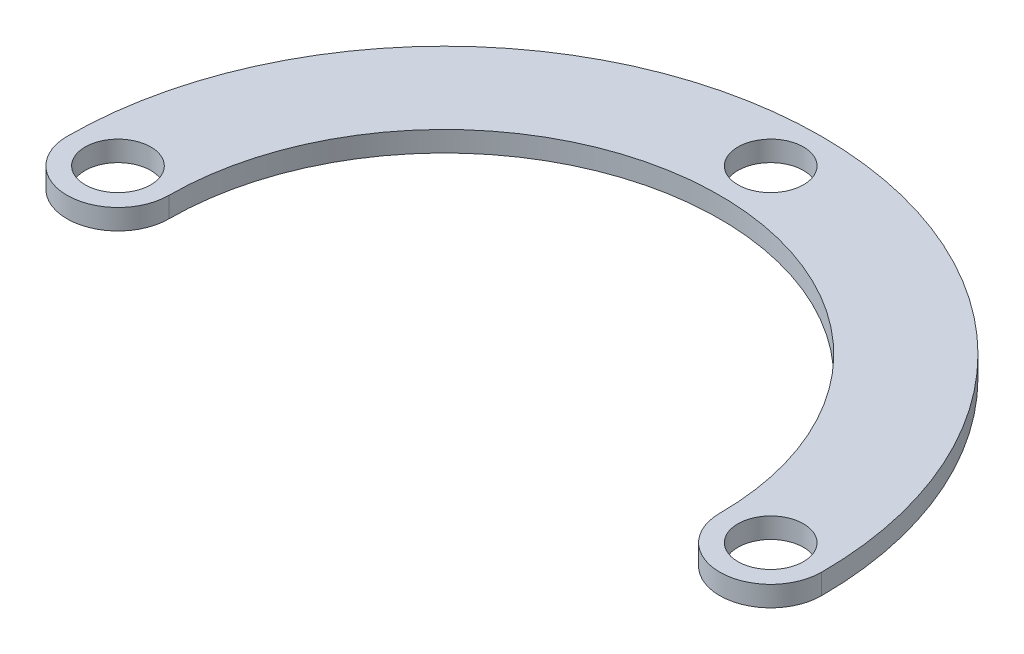
ISO-10303-21;
HEADER;
FILE_DESCRIPTION(('STEP AP214'),'2;1');
FILE_NAME('part.step','',(''),(''),'','','');
FILE_SCHEMA(('AUTOMOTIVE_DESIGN { 1 0 10303 214 1 1 1 1 }'));
ENDSEC;
DATA;
#1=APPLICATION_CONTEXT('core data for automotive mechanical design processes');
#2=APPLICATION_PROTOCOL_DEFINITION('international standard','automotive_design',2000,#1);
#3=PRODUCT_CONTEXT('',#1,'mechanical');
#4=PRODUCT('Part','Part','',(#3));
#5=PRODUCT_RELATED_PRODUCT_CATEGORY('part','',(#4));
#6=PRODUCT_DEFINITION_FORMATION('','',#4);
#7=PRODUCT_DEFINITION_CONTEXT('part definition',#1,'design');
#8=PRODUCT_DEFINITION('design','',#6,#7);
#9=PRODUCT_DEFINITION_SHAPE('','',#8);
#10=(LENGTH_UNIT() NAMED_UNIT(*) SI_UNIT(.MILLI.,.METRE.));
#11=(NAMED_UNIT(*) PLANE_ANGLE_UNIT() SI_UNIT($,.RADIAN.));
#12=(NAMED_UNIT(*) SI_UNIT($,.STERADIAN.) SOLID_ANGLE_UNIT());
#13=UNCERTAINTY_MEASURE_WITH_UNIT(LENGTH_MEASURE(1.E-05),#10,'distance_accuracy_value','');
#14=(GEOMETRIC_REPRESENTATION_CONTEXT(3) GLOBAL_UNCERTAINTY_ASSIGNED_CONTEXT((#13)) GLOBAL_UNIT_ASSIGNED_CONTEXT((#10,
#11,#12)) REPRESENTATION_CONTEXT('',''));
#15=CARTESIAN_POINT('',(0.,0.,0.));
#16=DIRECTION('',(0.,0.,1.));
#17=DIRECTION('',(1.,0.,0.));
#18=AXIS2_PLACEMENT_3D('',#15,#16,#17);
#19=CARTESIAN_POINT('',(25.4,1.5875,0.));
#20=DIRECTION('',(0.,-1.,0.));
#21=DIRECTION('',(0.,0.,-1.));
#22=AXIS2_PLACEMENT_3D('',#19,#20,#21);
#23=CYLINDRICAL_SURFACE('',#22,2.5527);
#24=CARTESIAN_POINT('',(25.4,1.5875,0.));
#25=DIRECTION('',(0.,1.,0.));
#26=DIRECTION('',(0.,0.,1.));
#27=AXIS2_PLACEMENT_3D('',#24,#25,#26);
#28=CIRCLE('',#27,2.5527);
#29=CARTESIAN_POINT('',(25.4,1.5875,2.55269999999998));
#30=VERTEX_POINT('',#29);
#31=EDGE_CURVE('E20',#30,#30,#28,.T.);
#32=ORIENTED_EDGE('',*,*,#31,.T.);
#33=EDGE_LOOP('',(#32));
#34=FACE_BOUND('',#33,.T.);
#35=CARTESIAN_POINT('',(25.4,0.,0.));
#36=DIRECTION('',(0.,1.,0.));
#37=DIRECTION('',(0.,0.,1.));
#38=AXIS2_PLACEMENT_3D('',#35,#36,#37);
#39=CIRCLE('',#38,2.5527);
#40=CARTESIAN_POINT('',(25.4,0.,2.55269999999998));
#41=VERTEX_POINT('',#40);
#42=EDGE_CURVE('E150',#41,#41,#39,.T.);
#43=ORIENTED_EDGE('',*,*,#42,.F.);
#44=EDGE_LOOP('',(#43));
#45=FACE_BOUND('',#44,.T.);
#46=ADVANCED_FACE('F17',(#34,#45),#23,.F.);
#47=CARTESIAN_POINT('',(-25.4,1.5875,0.));
#48=DIRECTION('',(0.,-1.,0.));
#49=DIRECTION('',(0.,0.,-1.));
#50=AXIS2_PLACEMENT_3D('',#47,#48,#49);
#51=CYLINDRICAL_SURFACE('',#50,2.5527);
#52=CARTESIAN_POINT('',(-25.4,1.5875,0.));
#53=DIRECTION('',(0.,1.,0.));
#54=DIRECTION('',(0.,0.,1.));
#55=AXIS2_PLACEMENT_3D('',#52,#53,#54);
#56=CIRCLE('',#55,2.5527);
#57=CARTESIAN_POINT('',(-25.4,1.5875,2.5527));
#58=VERTEX_POINT('',#57);
#59=EDGE_CURVE('E11',#58,#58,#56,.T.);
#60=ORIENTED_EDGE('',*,*,#59,.T.);
#61=EDGE_LOOP('',(#60));
#62=FACE_BOUND('',#61,.T.);
#63=CARTESIAN_POINT('',(-25.4,0.,0.));
#64=DIRECTION('',(0.,1.,0.));
#65=DIRECTION('',(0.,0.,1.));
#66=AXIS2_PLACEMENT_3D('',#63,#64,#65);
#67=CIRCLE('',#66,2.5527);
#68=CARTESIAN_POINT('',(-25.4,0.,2.5527));
#69=VERTEX_POINT('',#68);
#70=EDGE_CURVE('E156',#69,#69,#67,.T.);
#71=ORIENTED_EDGE('',*,*,#70,.F.);
#72=EDGE_LOOP('',(#71));
#73=FACE_BOUND('',#72,.T.);
#74=ADVANCED_FACE('F169',(#62,#73),#51,.F.);
#75=CARTESIAN_POINT('',(0.,1.5875,-25.4));
#76=DIRECTION('',(0.,-1.,0.));
#77=DIRECTION('',(0.,0.,-1.));
#78=AXIS2_PLACEMENT_3D('',#75,#76,#77);
#79=CYLINDRICAL_SURFACE('',#78,2.5527);
#80=CARTESIAN_POINT('',(0.,1.5875,-25.4));
#81=DIRECTION('',(0.,1.,0.));
#82=DIRECTION('',(0.,0.,1.));
#83=AXIS2_PLACEMENT_3D('',#80,#81,#82);
#84=CIRCLE('',#83,2.5527);
#85=CARTESIAN_POINT('',(0.,1.5875,-22.8473));
#86=VERTEX_POINT('',#85);
#87=EDGE_CURVE('E127',#86,#86,#84,.T.);
#88=ORIENTED_EDGE('',*,*,#87,.T.);
#89=EDGE_LOOP('',(#88));
#90=FACE_BOUND('',#89,.T.);
#91=CARTESIAN_POINT('',(0.,0.,-25.4));
#92=DIRECTION('',(0.,1.,0.));
#93=DIRECTION('',(0.,0.,1.));
#94=AXIS2_PLACEMENT_3D('',#91,#92,#93);
#95=CIRCLE('',#94,2.5527);
#96=CARTESIAN_POINT('',(0.,0.,-22.8473));
#97=VERTEX_POINT('',#96);
#98=EDGE_CURVE('E145',#97,#97,#95,.T.);
#99=ORIENTED_EDGE('',*,*,#98,.F.);
#100=EDGE_LOOP('',(#99));
#101=FACE_BOUND('',#100,.T.);
#102=ADVANCED_FACE('F174',(#90,#101),#79,.F.);
#103=CARTESIAN_POINT('',(0.,1.5875,0.));
#104=DIRECTION('',(0.,-1.,0.));
#105=DIRECTION('',(0.,0.,-1.));
#106=AXIS2_PLACEMENT_3D('',#103,#104,#105);
#107=CYLINDRICAL_SURFACE('',#106,29.36875);
#108=CARTESIAN_POINT('',(0.,1.5875,0.));
#109=DIRECTION('',(0.,1.,0.));
#110=DIRECTION('',(0.,0.,1.));
#111=AXIS2_PLACEMENT_3D('',#108,#109,#110);
#112=CIRCLE('',#111,29.36875);
#113=CARTESIAN_POINT('',(29.36875,1.5875,0.));
#114=VERTEX_POINT('',#113);
#115=CARTESIAN_POINT('',(-29.36875,1.5875,0.));
#116=VERTEX_POINT('',#115);
#117=EDGE_CURVE('E27',#114,#116,#112,.T.);
#118=ORIENTED_EDGE('',*,*,#117,.F.);
#119=DIRECTION('',(0.,-1.,0.));
#120=VECTOR('',#119,1.);
#121=CARTESIAN_POINT('',(29.36875,1.5875,0.));
#122=LINE('',#121,#120);
#123=CARTESIAN_POINT('',(29.36875,0.,0.));
#124=VERTEX_POINT('',#123);
#125=EDGE_CURVE('E115',#114,#124,#122,.T.);
#126=ORIENTED_EDGE('',*,*,#125,.T.);
#127=CARTESIAN_POINT('',(0.,0.,0.));
#128=DIRECTION('',(0.,1.,0.));
#129=DIRECTION('',(0.,0.,1.));
#130=AXIS2_PLACEMENT_3D('',#127,#128,#129);
#131=CIRCLE('',#130,29.36875);
#132=CARTESIAN_POINT('',(-29.36875,0.,0.));
#133=VERTEX_POINT('',#132);
#134=EDGE_CURVE('E69',#124,#133,#131,.T.);
#135=ORIENTED_EDGE('',*,*,#134,.T.);
#136=DIRECTION('',(0.,-1.,0.));
#137=VECTOR('',#136,1.);
#138=CARTESIAN_POINT('',(-29.36875,1.5875,0.));
#139=LINE('',#138,#137);
#140=EDGE_CURVE('E99',#116,#133,#139,.T.);
#141=ORIENTED_EDGE('',*,*,#140,.F.);
#142=EDGE_LOOP('',(#118,#126,#135,#141));
#143=FACE_BOUND('',#142,.T.);
#144=ADVANCED_FACE('F234',(#143),#107,.T.);
#145=CARTESIAN_POINT('',(0.,1.5875,0.));
#146=DIRECTION('',(0.,-1.,0.));
#147=DIRECTION('',(0.,0.,-1.));
#148=AXIS2_PLACEMENT_3D('',#145,#146,#147);
#149=CYLINDRICAL_SURFACE('',#148,21.43125);
#150=CARTESIAN_POINT('',(0.,1.5875,0.));
#151=DIRECTION('',(0.,-1.,0.));
#152=DIRECTION('',(0.,0.,1.));
#153=AXIS2_PLACEMENT_3D('',#150,#151,#152);
#154=CIRCLE('',#153,21.43125);
#155=CARTESIAN_POINT('',(-21.43125,1.5875,0.));
#156=VERTEX_POINT('',#155);
#157=CARTESIAN_POINT('',(21.43125,1.5875,0.));
#158=VERTEX_POINT('',#157);
#159=EDGE_CURVE('E54',#156,#158,#154,.T.);
#160=ORIENTED_EDGE('',*,*,#159,.F.);
#161=DIRECTION('',(0.,-1.,0.));
#162=VECTOR('',#161,1.);
#163=CARTESIAN_POINT('',(-21.43125,1.5875,0.));
#164=LINE('',#163,#162);
#165=CARTESIAN_POINT('',(-21.43125,0.,0.));
#166=VERTEX_POINT('',#165);
#167=EDGE_CURVE('E90',#156,#166,#164,.T.);
#168=ORIENTED_EDGE('',*,*,#167,.T.);
#169=CARTESIAN_POINT('',(0.,0.,0.));
#170=DIRECTION('',(0.,-1.,0.));
#171=DIRECTION('',(0.,0.,1.));
#172=AXIS2_PLACEMENT_3D('',#169,#170,#171);
#173=CIRCLE('',#172,21.43125);
#174=CARTESIAN_POINT('',(21.43125,0.,0.));
#175=VERTEX_POINT('',#174);
#176=EDGE_CURVE('E76',#166,#175,#173,.T.);
#177=ORIENTED_EDGE('',*,*,#176,.T.);
#178=DIRECTION('',(0.,-1.,0.));
#179=VECTOR('',#178,1.);
#180=CARTESIAN_POINT('',(21.43125,1.5875,0.));
#181=LINE('',#180,#179);
#182=EDGE_CURVE('E101',#158,#175,#181,.T.);
#183=ORIENTED_EDGE('',*,*,#182,.F.);
#184=EDGE_LOOP('',(#160,#168,#177,#183));
#185=FACE_BOUND('',#184,.T.);
#186=ADVANCED_FACE('F91',(#185),#149,.F.);
#187=CARTESIAN_POINT('',(-12.7,1.5875,0.));
#188=DIRECTION('',(0.,1.,0.));
#189=DIRECTION('',(0.,0.,1.));
#190=AXIS2_PLACEMENT_3D('',#187,#188,#189);
#191=PLANE('',#190);
#192=ORIENTED_EDGE('',*,*,#59,.F.);
#193=EDGE_LOOP('',(#192));
#194=FACE_BOUND('',#193,.T.);
#195=CARTESIAN_POINT('',(-25.4,1.5875,0.));
#196=DIRECTION('',(0.,1.,0.));
#197=DIRECTION('',(0.,0.,1.));
#198=AXIS2_PLACEMENT_3D('',#195,#196,#197);
#199=CIRCLE('',#198,3.96875);
#200=EDGE_CURVE('E95',#116,#156,#199,.T.);
#201=ORIENTED_EDGE('',*,*,#200,.T.);
#202=ORIENTED_EDGE('',*,*,#159,.T.);
#203=CARTESIAN_POINT('',(25.4,1.5875,0.));
#204=DIRECTION('',(0.,1.,0.));
#205=DIRECTION('',(0.,0.,1.));
#206=AXIS2_PLACEMENT_3D('',#203,#204,#205);
#207=CIRCLE('',#206,3.96875);
#208=EDGE_CURVE('E108',#158,#114,#207,.T.);
#209=ORIENTED_EDGE('',*,*,#208,.T.);
#210=ORIENTED_EDGE('',*,*,#117,.T.);
#211=EDGE_LOOP('',(#201,#202,#209,#210));
#212=FACE_BOUND('',#211,.T.);
#213=ORIENTED_EDGE('',*,*,#87,.F.);
#214=EDGE_LOOP('',(#213));
#215=FACE_BOUND('',#214,.T.);
#216=ORIENTED_EDGE('',*,*,#31,.F.);
#217=EDGE_LOOP('',(#216));
#218=FACE_BOUND('',#217,.T.);
#219=ADVANCED_FACE('F252',(#194,#212,#215,#218),#191,.T.);
#220=CARTESIAN_POINT('',(-12.7,0.,0.));
#221=DIRECTION('',(0.,1.,0.));
#222=DIRECTION('',(0.,0.,1.));
#223=AXIS2_PLACEMENT_3D('',#220,#221,#222);
#224=PLANE('',#223);
#225=CARTESIAN_POINT('',(-25.4,0.,0.));
#226=DIRECTION('',(0.,1.,0.));
#227=DIRECTION('',(0.,0.,1.));
#228=AXIS2_PLACEMENT_3D('',#225,#226,#227);
#229=CIRCLE('',#228,3.96875);
#230=EDGE_CURVE('E84',#133,#166,#229,.T.);
#231=ORIENTED_EDGE('',*,*,#230,.F.);
#232=ORIENTED_EDGE('',*,*,#134,.F.);
#233=CARTESIAN_POINT('',(25.4,0.,0.));
#234=DIRECTION('',(0.,1.,0.));
#235=DIRECTION('',(0.,0.,1.));
#236=AXIS2_PLACEMENT_3D('',#233,#234,#235);
#237=CIRCLE('',#236,3.96875);
#238=EDGE_CURVE('E86',#175,#124,#237,.T.);
#239=ORIENTED_EDGE('',*,*,#238,.F.);
#240=ORIENTED_EDGE('',*,*,#176,.F.);
#241=EDGE_LOOP('',(#231,#232,#239,#240));
#242=FACE_BOUND('',#241,.T.);
#243=ORIENTED_EDGE('',*,*,#98,.T.);
#244=EDGE_LOOP('',(#243));
#245=FACE_BOUND('',#244,.T.);
#246=ORIENTED_EDGE('',*,*,#70,.T.);
#247=EDGE_LOOP('',(#246));
#248=FACE_BOUND('',#247,.T.);
#249=ORIENTED_EDGE('',*,*,#42,.T.);
#250=EDGE_LOOP('',(#249));
#251=FACE_BOUND('',#250,.T.);
#252=ADVANCED_FACE('F81',(#242,#245,#248,#251),#224,.F.);
#253=CARTESIAN_POINT('',(-25.4,1.5875,0.));
#254=DIRECTION('',(0.,-1.,0.));
#255=DIRECTION('',(0.,0.,-1.));
#256=AXIS2_PLACEMENT_3D('',#253,#254,#255);
#257=CYLINDRICAL_SURFACE('',#256,3.96875);
#258=ORIENTED_EDGE('',*,*,#230,.T.);
#259=ORIENTED_EDGE('',*,*,#167,.F.);
#260=ORIENTED_EDGE('',*,*,#200,.F.);
#261=ORIENTED_EDGE('',*,*,#140,.T.);
#262=EDGE_LOOP('',(#258,#259,#260,#261));
#263=FACE_BOUND('',#262,.T.);
#264=ADVANCED_FACE('F98',(#263),#257,.T.);
#265=CARTESIAN_POINT('',(25.4,1.5875,0.));
#266=DIRECTION('',(0.,-1.,0.));
#267=DIRECTION('',(0.,0.,-1.));
#268=AXIS2_PLACEMENT_3D('',#265,#266,#267);
#269=CYLINDRICAL_SURFACE('',#268,3.96875);
#270=ORIENTED_EDGE('',*,*,#238,.T.);
#271=ORIENTED_EDGE('',*,*,#125,.F.);
#272=ORIENTED_EDGE('',*,*,#208,.F.);
#273=ORIENTED_EDGE('',*,*,#182,.T.);
#274=EDGE_LOOP('',(#270,#271,#272,#273));
#275=FACE_BOUND('',#274,.T.);
#276=ADVANCED_FACE('F278',(#275),#269,.T.);
#277=CLOSED_SHELL('',(#46,#74,#102,#144,#186,#219,#252,#264,#276));
#278=MANIFOLD_SOLID_BREP('B1',#277);
#279=ADVANCED_BREP_SHAPE_REPRESENTATION('',(#18,#278),#14);
#280=SHAPE_DEFINITION_REPRESENTATION(#9,#279);
ENDSEC;
END-ISO-10303-21;
